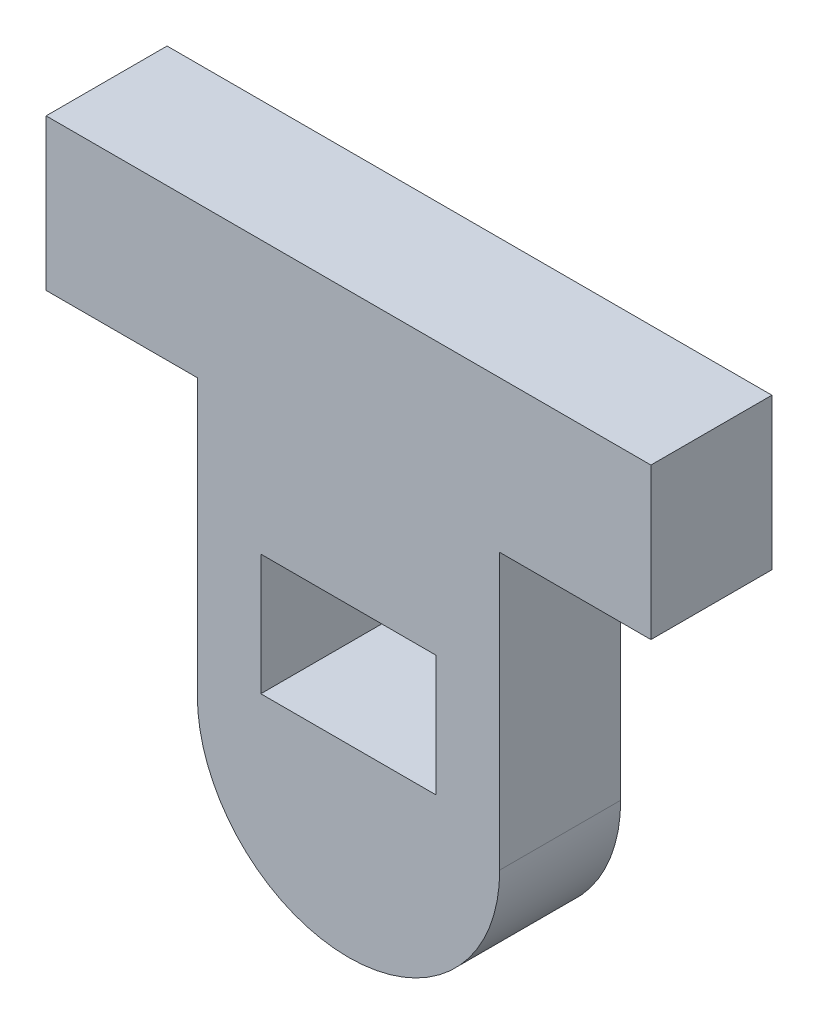
ISO-10303-21;
HEADER;
FILE_DESCRIPTION(('STEP AP214'),'2;1');
FILE_NAME('part.step','',(''),(''),'','','');
FILE_SCHEMA(('AUTOMOTIVE_DESIGN { 1 0 10303 214 1 1 1 1 }'));
ENDSEC;
DATA;
#1=APPLICATION_CONTEXT('core data for automotive mechanical design processes');
#2=APPLICATION_PROTOCOL_DEFINITION('international standard','automotive_design',2000,#1);
#3=PRODUCT_CONTEXT('',#1,'mechanical');
#4=PRODUCT('Part','Part','',(#3));
#5=PRODUCT_RELATED_PRODUCT_CATEGORY('part','',(#4));
#6=PRODUCT_DEFINITION_FORMATION('','',#4);
#7=PRODUCT_DEFINITION_CONTEXT('part definition',#1,'design');
#8=PRODUCT_DEFINITION('design','',#6,#7);
#9=PRODUCT_DEFINITION_SHAPE('','',#8);
#10=(LENGTH_UNIT() NAMED_UNIT(*) SI_UNIT(.MILLI.,.METRE.));
#11=(NAMED_UNIT(*) PLANE_ANGLE_UNIT() SI_UNIT($,.RADIAN.));
#12=(NAMED_UNIT(*) SI_UNIT($,.STERADIAN.) SOLID_ANGLE_UNIT());
#13=UNCERTAINTY_MEASURE_WITH_UNIT(LENGTH_MEASURE(1.E-05),#10,'distance_accuracy_value','');
#14=(GEOMETRIC_REPRESENTATION_CONTEXT(3) GLOBAL_UNCERTAINTY_ASSIGNED_CONTEXT((#13)) GLOBAL_UNIT_ASSIGNED_CONTEXT((#10,
#11,#12)) REPRESENTATION_CONTEXT('',''));
#15=CARTESIAN_POINT('',(0.,0.,0.));
#16=DIRECTION('',(0.,0.,1.));
#17=DIRECTION('',(1.,0.,0.));
#18=AXIS2_PLACEMENT_3D('',#15,#16,#17);
#19=CARTESIAN_POINT('',(6.35,6.98500000000001,5.08));
#20=DIRECTION('',(0.,0.,-1.));
#21=DIRECTION('',(-1.,0.,0.));
#22=AXIS2_PLACEMENT_3D('',#19,#20,#21);
#23=CYLINDRICAL_SURFACE('',#22,6.35);
#24=CARTESIAN_POINT('',(6.35,6.98500000000001,0.));
#25=DIRECTION('',(0.,0.,1.));
#26=DIRECTION('',(1.,0.,0.));
#27=AXIS2_PLACEMENT_3D('',#24,#25,#26);
#28=CIRCLE('',#27,6.35);
#29=CARTESIAN_POINT('',(0.,6.98500000000001,0.));
#30=VERTEX_POINT('',#29);
#31=CARTESIAN_POINT('',(12.7,6.98500000000001,0.));
#32=VERTEX_POINT('',#31);
#33=EDGE_CURVE('E154',#30,#32,#28,.T.);
#34=ORIENTED_EDGE('',*,*,#33,.T.);
#35=DIRECTION('',(0.,0.,-1.));
#36=VECTOR('',#35,1.);
#37=CARTESIAN_POINT('',(12.7,6.98500000000001,5.08));
#38=LINE('',#37,#36);
#39=CARTESIAN_POINT('',(12.7,6.98500000000001,5.08));
#40=VERTEX_POINT('',#39);
#41=EDGE_CURVE('E11',#40,#32,#38,.T.);
#42=ORIENTED_EDGE('',*,*,#41,.F.);
#43=CARTESIAN_POINT('',(6.35,6.98500000000001,5.08));
#44=DIRECTION('',(0.,0.,1.));
#45=DIRECTION('',(1.,0.,0.));
#46=AXIS2_PLACEMENT_3D('',#43,#44,#45);
#47=CIRCLE('',#46,6.35);
#48=CARTESIAN_POINT('',(0.,6.98500000000001,5.08));
#49=VERTEX_POINT('',#48);
#50=EDGE_CURVE('E158',#49,#40,#47,.T.);
#51=ORIENTED_EDGE('',*,*,#50,.F.);
#52=DIRECTION('',(0.,0.,-1.));
#53=VECTOR('',#52,1.);
#54=CARTESIAN_POINT('',(0.,6.98500000000001,5.08));
#55=LINE('',#54,#53);
#56=EDGE_CURVE('E176',#49,#30,#55,.T.);
#57=ORIENTED_EDGE('',*,*,#56,.T.);
#58=EDGE_LOOP('',(#34,#42,#51,#57));
#59=FACE_BOUND('',#58,.T.);
#60=ADVANCED_FACE('F33',(#59),#23,.T.);
#61=CARTESIAN_POINT('',(12.7,6.98500000000001,5.08));
#62=DIRECTION('',(-1.,0.,0.));
#63=DIRECTION('',(0.,-1.,0.));
#64=AXIS2_PLACEMENT_3D('',#61,#62,#63);
#65=PLANE('',#64);
#66=DIRECTION('',(0.,1.,0.));
#67=VECTOR('',#66,1.);
#68=CARTESIAN_POINT('',(12.7,6.98500000000001,0.));
#69=LINE('',#68,#67);
#70=CARTESIAN_POINT('',(12.7,18.542,0.));
#71=VERTEX_POINT('',#70);
#72=EDGE_CURVE('E179',#32,#71,#69,.T.);
#73=ORIENTED_EDGE('',*,*,#72,.T.);
#74=DIRECTION('',(0.,0.,-1.));
#75=VECTOR('',#74,1.);
#76=CARTESIAN_POINT('',(12.7,18.542,5.08));
#77=LINE('',#76,#75);
#78=CARTESIAN_POINT('',(12.7,18.542,5.08));
#79=VERTEX_POINT('',#78);
#80=EDGE_CURVE('E40',#79,#71,#77,.T.);
#81=ORIENTED_EDGE('',*,*,#80,.F.);
#82=DIRECTION('',(0.,1.,0.));
#83=VECTOR('',#82,1.);
#84=CARTESIAN_POINT('',(12.7,6.98500000000001,5.08));
#85=LINE('',#84,#83);
#86=EDGE_CURVE('E161',#40,#79,#85,.T.);
#87=ORIENTED_EDGE('',*,*,#86,.F.);
#88=ORIENTED_EDGE('',*,*,#41,.T.);
#89=EDGE_LOOP('',(#73,#81,#87,#88));
#90=FACE_BOUND('',#89,.T.);
#91=ADVANCED_FACE('F234',(#90),#65,.F.);
#92=CARTESIAN_POINT('',(12.7,18.542,5.08));
#93=DIRECTION('',(0.,1.,0.));
#94=DIRECTION('',(0.,0.,1.));
#95=AXIS2_PLACEMENT_3D('',#92,#93,#94);
#96=PLANE('',#95);
#97=DIRECTION('',(1.,0.,0.));
#98=VECTOR('',#97,1.);
#99=CARTESIAN_POINT('',(12.7,18.542,0.));
#100=LINE('',#99,#98);
#101=CARTESIAN_POINT('',(19.05,18.542,0.));
#102=VERTEX_POINT('',#101);
#103=EDGE_CURVE('E181',#71,#102,#100,.T.);
#104=ORIENTED_EDGE('',*,*,#103,.T.);
#105=DIRECTION('',(0.,0.,-1.));
#106=VECTOR('',#105,1.);
#107=CARTESIAN_POINT('',(19.05,18.542,5.08));
#108=LINE('',#107,#106);
#109=CARTESIAN_POINT('',(19.05,18.542,5.08));
#110=VERTEX_POINT('',#109);
#111=EDGE_CURVE('E206',#110,#102,#108,.T.);
#112=ORIENTED_EDGE('',*,*,#111,.F.);
#113=DIRECTION('',(1.,0.,0.));
#114=VECTOR('',#113,1.);
#115=CARTESIAN_POINT('',(12.7,18.542,5.08));
#116=LINE('',#115,#114);
#117=EDGE_CURVE('E164',#79,#110,#116,.T.);
#118=ORIENTED_EDGE('',*,*,#117,.F.);
#119=ORIENTED_EDGE('',*,*,#80,.T.);
#120=EDGE_LOOP('',(#104,#112,#118,#119));
#121=FACE_BOUND('',#120,.T.);
#122=ADVANCED_FACE('F213',(#121),#96,.F.);
#123=CARTESIAN_POINT('',(19.05,18.542,5.08));
#124=DIRECTION('',(-1.,0.,0.));
#125=DIRECTION('',(0.,0.,1.));
#126=AXIS2_PLACEMENT_3D('',#123,#124,#125);
#127=PLANE('',#126);
#128=DIRECTION('',(0.,1.,0.));
#129=VECTOR('',#128,1.);
#130=CARTESIAN_POINT('',(19.05,18.542,0.));
#131=LINE('',#130,#129);
#132=CARTESIAN_POINT('',(19.05,24.892,0.));
#133=VERTEX_POINT('',#132);
#134=EDGE_CURVE('E183',#102,#133,#131,.T.);
#135=ORIENTED_EDGE('',*,*,#134,.T.);
#136=DIRECTION('',(0.,0.,-1.));
#137=VECTOR('',#136,1.);
#138=CARTESIAN_POINT('',(19.05,24.892,5.08));
#139=LINE('',#138,#137);
#140=CARTESIAN_POINT('',(19.05,24.892,5.08));
#141=VERTEX_POINT('',#140);
#142=EDGE_CURVE('E203',#141,#133,#139,.T.);
#143=ORIENTED_EDGE('',*,*,#142,.F.);
#144=DIRECTION('',(0.,1.,0.));
#145=VECTOR('',#144,1.);
#146=CARTESIAN_POINT('',(19.05,18.542,5.08));
#147=LINE('',#146,#145);
#148=EDGE_CURVE('E166',#110,#141,#147,.T.);
#149=ORIENTED_EDGE('',*,*,#148,.F.);
#150=ORIENTED_EDGE('',*,*,#111,.T.);
#151=EDGE_LOOP('',(#135,#143,#149,#150));
#152=FACE_BOUND('',#151,.T.);
#153=ADVANCED_FACE('F222',(#152),#127,.F.);
#154=CARTESIAN_POINT('',(19.05,24.892,5.08));
#155=DIRECTION('',(0.,-1.,0.));
#156=DIRECTION('',(1.,0.,0.));
#157=AXIS2_PLACEMENT_3D('',#154,#155,#156);
#158=PLANE('',#157);
#159=DIRECTION('',(-1.,0.,0.));
#160=VECTOR('',#159,1.);
#161=CARTESIAN_POINT('',(19.05,24.892,0.));
#162=LINE('',#161,#160);
#163=CARTESIAN_POINT('',(-6.35,24.892,0.));
#164=VERTEX_POINT('',#163);
#165=EDGE_CURVE('E185',#133,#164,#162,.T.);
#166=ORIENTED_EDGE('',*,*,#165,.T.);
#167=DIRECTION('',(0.,0.,-1.));
#168=VECTOR('',#167,1.);
#169=CARTESIAN_POINT('',(-6.35,24.892,5.08));
#170=LINE('',#169,#168);
#171=CARTESIAN_POINT('',(-6.35,24.892,5.08));
#172=VERTEX_POINT('',#171);
#173=EDGE_CURVE('E200',#172,#164,#170,.T.);
#174=ORIENTED_EDGE('',*,*,#173,.F.);
#175=DIRECTION('',(-1.,0.,0.));
#176=VECTOR('',#175,1.);
#177=CARTESIAN_POINT('',(19.05,24.892,5.08));
#178=LINE('',#177,#176);
#179=EDGE_CURVE('E168',#141,#172,#178,.T.);
#180=ORIENTED_EDGE('',*,*,#179,.F.);
#181=ORIENTED_EDGE('',*,*,#142,.T.);
#182=EDGE_LOOP('',(#166,#174,#180,#181));
#183=FACE_BOUND('',#182,.T.);
#184=ADVANCED_FACE('F226',(#183),#158,.F.);
#185=CARTESIAN_POINT('',(-6.35,24.892,5.08));
#186=DIRECTION('',(1.,0.,0.));
#187=DIRECTION('',(0.,0.,-1.));
#188=AXIS2_PLACEMENT_3D('',#185,#186,#187);
#189=PLANE('',#188);
#190=DIRECTION('',(0.,-1.,0.));
#191=VECTOR('',#190,1.);
#192=CARTESIAN_POINT('',(-6.35,24.892,0.));
#193=LINE('',#192,#191);
#194=CARTESIAN_POINT('',(-6.35,18.542,0.));
#195=VERTEX_POINT('',#194);
#196=EDGE_CURVE('E187',#164,#195,#193,.T.);
#197=ORIENTED_EDGE('',*,*,#196,.T.);
#198=DIRECTION('',(0.,0.,-1.));
#199=VECTOR('',#198,1.);
#200=CARTESIAN_POINT('',(-6.35,18.542,5.08));
#201=LINE('',#200,#199);
#202=CARTESIAN_POINT('',(-6.35,18.542,5.08));
#203=VERTEX_POINT('',#202);
#204=EDGE_CURVE('E197',#203,#195,#201,.T.);
#205=ORIENTED_EDGE('',*,*,#204,.F.);
#206=DIRECTION('',(0.,-1.,0.));
#207=VECTOR('',#206,1.);
#208=CARTESIAN_POINT('',(-6.35,24.892,5.08));
#209=LINE('',#208,#207);
#210=EDGE_CURVE('E170',#172,#203,#209,.T.);
#211=ORIENTED_EDGE('',*,*,#210,.F.);
#212=ORIENTED_EDGE('',*,*,#173,.T.);
#213=EDGE_LOOP('',(#197,#205,#211,#212));
#214=FACE_BOUND('',#213,.T.);
#215=ADVANCED_FACE('F247',(#214),#189,.F.);
#216=CARTESIAN_POINT('',(-6.35,18.542,5.08));
#217=DIRECTION('',(0.,1.,0.));
#218=DIRECTION('',(-1.,0.,0.));
#219=AXIS2_PLACEMENT_3D('',#216,#217,#218);
#220=PLANE('',#219);
#221=DIRECTION('',(1.,0.,0.));
#222=VECTOR('',#221,1.);
#223=CARTESIAN_POINT('',(-6.35,18.542,0.));
#224=LINE('',#223,#222);
#225=CARTESIAN_POINT('',(0.,18.542,0.));
#226=VERTEX_POINT('',#225);
#227=EDGE_CURVE('E189',#195,#226,#224,.T.);
#228=ORIENTED_EDGE('',*,*,#227,.T.);
#229=DIRECTION('',(0.,0.,-1.));
#230=VECTOR('',#229,1.);
#231=CARTESIAN_POINT('',(0.,18.542,5.08));
#232=LINE('',#231,#230);
#233=CARTESIAN_POINT('',(0.,18.542,5.08));
#234=VERTEX_POINT('',#233);
#235=EDGE_CURVE('E194',#234,#226,#232,.T.);
#236=ORIENTED_EDGE('',*,*,#235,.F.);
#237=DIRECTION('',(1.,0.,0.));
#238=VECTOR('',#237,1.);
#239=CARTESIAN_POINT('',(-6.35,18.542,5.08));
#240=LINE('',#239,#238);
#241=EDGE_CURVE('E172',#203,#234,#240,.T.);
#242=ORIENTED_EDGE('',*,*,#241,.F.);
#243=ORIENTED_EDGE('',*,*,#204,.T.);
#244=EDGE_LOOP('',(#228,#236,#242,#243));
#245=FACE_BOUND('',#244,.T.);
#246=ADVANCED_FACE('F245',(#245),#220,.F.);
#247=CARTESIAN_POINT('',(0.,6.98500000000001,5.08));
#248=DIRECTION('',(1.,0.,0.));
#249=DIRECTION('',(0.,0.,-1.));
#250=AXIS2_PLACEMENT_3D('',#247,#248,#249);
#251=PLANE('',#250);
#252=DIRECTION('',(0.,-1.,0.));
#253=VECTOR('',#252,1.);
#254=CARTESIAN_POINT('',(0.,6.98500000000001,0.));
#255=LINE('',#254,#253);
#256=EDGE_CURVE('E162',#226,#30,#255,.T.);
#257=ORIENTED_EDGE('',*,*,#256,.T.);
#258=ORIENTED_EDGE('',*,*,#56,.F.);
#259=DIRECTION('',(0.,-1.,0.));
#260=VECTOR('',#259,1.);
#261=CARTESIAN_POINT('',(0.,6.98500000000001,5.08));
#262=LINE('',#261,#260);
#263=EDGE_CURVE('E174',#234,#49,#262,.T.);
#264=ORIENTED_EDGE('',*,*,#263,.F.);
#265=ORIENTED_EDGE('',*,*,#235,.T.);
#266=EDGE_LOOP('',(#257,#258,#264,#265));
#267=FACE_BOUND('',#266,.T.);
#268=ADVANCED_FACE('F240',(#267),#251,.F.);
#269=CARTESIAN_POINT('',(6.35,6.98500000000001,5.08));
#270=DIRECTION('',(0.,0.,1.));
#271=DIRECTION('',(1.,0.,0.));
#272=AXIS2_PLACEMENT_3D('',#269,#270,#271);
#273=PLANE('',#272);
#274=DIRECTION('',(-1.,0.,0.));
#275=VECTOR('',#274,1.);
#276=CARTESIAN_POINT('',(6.35,13.462,5.08));
#277=LINE('',#276,#275);
#278=CARTESIAN_POINT('',(10.033,13.462,5.08));
#279=VERTEX_POINT('',#278);
#280=CARTESIAN_POINT('',(2.667,13.462,5.08));
#281=VERTEX_POINT('',#280);
#282=EDGE_CURVE('E125',#279,#281,#277,.T.);
#283=ORIENTED_EDGE('',*,*,#282,.F.);
#284=DIRECTION('',(0.,1.,0.));
#285=VECTOR('',#284,1.);
#286=CARTESIAN_POINT('',(10.033,13.462,5.08));
#287=LINE('',#286,#285);
#288=CARTESIAN_POINT('',(10.033,8.382,5.08));
#289=VERTEX_POINT('',#288);
#290=EDGE_CURVE('E140',#289,#279,#287,.T.);
#291=ORIENTED_EDGE('',*,*,#290,.F.);
#292=DIRECTION('',(1.,0.,0.));
#293=VECTOR('',#292,1.);
#294=CARTESIAN_POINT('',(10.033,8.382,5.08));
#295=LINE('',#294,#293);
#296=CARTESIAN_POINT('',(2.667,8.382,5.08));
#297=VERTEX_POINT('',#296);
#298=EDGE_CURVE('E147',#297,#289,#295,.T.);
#299=ORIENTED_EDGE('',*,*,#298,.F.);
#300=DIRECTION('',(0.,-1.,0.));
#301=VECTOR('',#300,1.);
#302=CARTESIAN_POINT('',(2.667,8.382,5.08));
#303=LINE('',#302,#301);
#304=EDGE_CURVE('E145',#281,#297,#303,.T.);
#305=ORIENTED_EDGE('',*,*,#304,.F.);
#306=EDGE_LOOP('',(#283,#291,#299,#305));
#307=FACE_BOUND('',#306,.T.);
#308=ORIENTED_EDGE('',*,*,#50,.T.);
#309=ORIENTED_EDGE('',*,*,#86,.T.);
#310=ORIENTED_EDGE('',*,*,#117,.T.);
#311=ORIENTED_EDGE('',*,*,#148,.T.);
#312=ORIENTED_EDGE('',*,*,#179,.T.);
#313=ORIENTED_EDGE('',*,*,#210,.T.);
#314=ORIENTED_EDGE('',*,*,#241,.T.);
#315=ORIENTED_EDGE('',*,*,#263,.T.);
#316=EDGE_LOOP('',(#308,#309,#310,#311,#312,#313,#314,#315));
#317=FACE_BOUND('',#316,.T.);
#318=ADVANCED_FACE('F230',(#307,#317),#273,.T.);
#319=CARTESIAN_POINT('',(6.35,6.98500000000001,0.));
#320=DIRECTION('',(0.,0.,1.));
#321=DIRECTION('',(1.,0.,0.));
#322=AXIS2_PLACEMENT_3D('',#319,#320,#321);
#323=PLANE('',#322);
#324=DIRECTION('',(0.,1.,0.));
#325=VECTOR('',#324,1.);
#326=CARTESIAN_POINT('',(10.033,13.462,0.));
#327=LINE('',#326,#325);
#328=CARTESIAN_POINT('',(10.033,8.382,0.));
#329=VERTEX_POINT('',#328);
#330=CARTESIAN_POINT('',(10.033,13.462,0.));
#331=VERTEX_POINT('',#330);
#332=EDGE_CURVE('E128',#329,#331,#327,.T.);
#333=ORIENTED_EDGE('',*,*,#332,.T.);
#334=DIRECTION('',(-1.,0.,0.));
#335=VECTOR('',#334,1.);
#336=CARTESIAN_POINT('',(2.667,13.462,0.));
#337=LINE('',#336,#335);
#338=CARTESIAN_POINT('',(2.667,13.462,0.));
#339=VERTEX_POINT('',#338);
#340=EDGE_CURVE('E122',#331,#339,#337,.T.);
#341=ORIENTED_EDGE('',*,*,#340,.T.);
#342=DIRECTION('',(0.,-1.,0.));
#343=VECTOR('',#342,1.);
#344=CARTESIAN_POINT('',(2.667,8.382,0.));
#345=LINE('',#344,#343);
#346=CARTESIAN_POINT('',(2.667,8.382,0.));
#347=VERTEX_POINT('',#346);
#348=EDGE_CURVE('E131',#339,#347,#345,.T.);
#349=ORIENTED_EDGE('',*,*,#348,.T.);
#350=DIRECTION('',(1.,0.,0.));
#351=VECTOR('',#350,1.);
#352=CARTESIAN_POINT('',(10.033,8.382,0.));
#353=LINE('',#352,#351);
#354=EDGE_CURVE('E55',#347,#329,#353,.T.);
#355=ORIENTED_EDGE('',*,*,#354,.T.);
#356=EDGE_LOOP('',(#333,#341,#349,#355));
#357=FACE_BOUND('',#356,.T.);
#358=ORIENTED_EDGE('',*,*,#33,.F.);
#359=ORIENTED_EDGE('',*,*,#256,.F.);
#360=ORIENTED_EDGE('',*,*,#227,.F.);
#361=ORIENTED_EDGE('',*,*,#196,.F.);
#362=ORIENTED_EDGE('',*,*,#165,.F.);
#363=ORIENTED_EDGE('',*,*,#134,.F.);
#364=ORIENTED_EDGE('',*,*,#103,.F.);
#365=ORIENTED_EDGE('',*,*,#72,.F.);
#366=EDGE_LOOP('',(#358,#359,#360,#361,#362,#363,#364,#365));
#367=FACE_BOUND('',#366,.T.);
#368=ADVANCED_FACE('F136',(#357,#367),#323,.F.);
#369=CARTESIAN_POINT('',(6.35,13.462,0.));
#370=DIRECTION('',(0.,1.,0.));
#371=DIRECTION('',(0.,0.,1.));
#372=AXIS2_PLACEMENT_3D('',#369,#370,#371);
#373=PLANE('',#372);
#374=ORIENTED_EDGE('',*,*,#282,.T.);
#375=DIRECTION('',(0.,0.,1.));
#376=VECTOR('',#375,1.);
#377=CARTESIAN_POINT('',(2.667,13.462,0.));
#378=LINE('',#377,#376);
#379=EDGE_CURVE('E47',#339,#281,#378,.T.);
#380=ORIENTED_EDGE('',*,*,#379,.F.);
#381=ORIENTED_EDGE('',*,*,#340,.F.);
#382=DIRECTION('',(0.,0.,1.));
#383=VECTOR('',#382,1.);
#384=CARTESIAN_POINT('',(10.033,13.462,0.));
#385=LINE('',#384,#383);
#386=EDGE_CURVE('E152',#331,#279,#385,.T.);
#387=ORIENTED_EDGE('',*,*,#386,.T.);
#388=EDGE_LOOP('',(#374,#380,#381,#387));
#389=FACE_BOUND('',#388,.T.);
#390=ADVANCED_FACE('F120',(#389),#373,.F.);
#391=CARTESIAN_POINT('',(10.033,13.462,0.));
#392=DIRECTION('',(1.,0.,0.));
#393=DIRECTION('',(0.,0.,-1.));
#394=AXIS2_PLACEMENT_3D('',#391,#392,#393);
#395=PLANE('',#394);
#396=ORIENTED_EDGE('',*,*,#290,.T.);
#397=ORIENTED_EDGE('',*,*,#386,.F.);
#398=ORIENTED_EDGE('',*,*,#332,.F.);
#399=DIRECTION('',(0.,0.,1.));
#400=VECTOR('',#399,1.);
#401=CARTESIAN_POINT('',(10.033,8.382,0.));
#402=LINE('',#401,#400);
#403=EDGE_CURVE('E155',#329,#289,#402,.T.);
#404=ORIENTED_EDGE('',*,*,#403,.T.);
#405=EDGE_LOOP('',(#396,#397,#398,#404));
#406=FACE_BOUND('',#405,.T.);
#407=ADVANCED_FACE('F319',(#406),#395,.F.);
#408=CARTESIAN_POINT('',(10.033,8.382,0.));
#409=DIRECTION('',(0.,-1.,0.));
#410=DIRECTION('',(1.,0.,0.));
#411=AXIS2_PLACEMENT_3D('',#408,#409,#410);
#412=PLANE('',#411);
#413=ORIENTED_EDGE('',*,*,#298,.T.);
#414=ORIENTED_EDGE('',*,*,#403,.F.);
#415=ORIENTED_EDGE('',*,*,#354,.F.);
#416=DIRECTION('',(0.,0.,1.));
#417=VECTOR('',#416,1.);
#418=CARTESIAN_POINT('',(2.667,8.382,0.));
#419=LINE('',#418,#417);
#420=EDGE_CURVE('E127',#347,#297,#419,.T.);
#421=ORIENTED_EDGE('',*,*,#420,.T.);
#422=EDGE_LOOP('',(#413,#414,#415,#421));
#423=FACE_BOUND('',#422,.T.);
#424=ADVANCED_FACE('F328',(#423),#412,.F.);
#425=CARTESIAN_POINT('',(2.667,8.382,0.));
#426=DIRECTION('',(-1.,0.,0.));
#427=DIRECTION('',(0.,0.,1.));
#428=AXIS2_PLACEMENT_3D('',#425,#426,#427);
#429=PLANE('',#428);
#430=ORIENTED_EDGE('',*,*,#304,.T.);
#431=ORIENTED_EDGE('',*,*,#420,.F.);
#432=ORIENTED_EDGE('',*,*,#348,.F.);
#433=ORIENTED_EDGE('',*,*,#379,.T.);
#434=EDGE_LOOP('',(#430,#431,#432,#433));
#435=FACE_BOUND('',#434,.T.);
#436=ADVANCED_FACE('F132',(#435),#429,.F.);
#437=CLOSED_SHELL('',(#60,#91,#122,#153,#184,#215,#246,#268,#318,#368,#390,#407,#424,#436));
#438=MANIFOLD_SOLID_BREP('B2',#437);
#439=ADVANCED_BREP_SHAPE_REPRESENTATION('',(#18,#438),#14);
#440=SHAPE_DEFINITION_REPRESENTATION(#9,#439);
ENDSEC;
END-ISO-10303-21;
